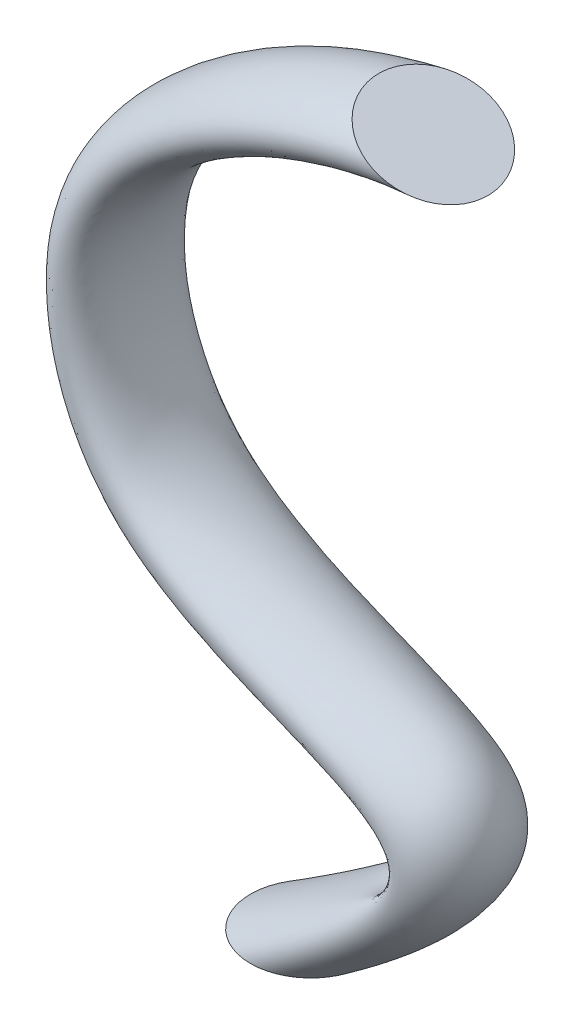
ISO-10303-21;
HEADER;
FILE_DESCRIPTION(('STEP AP214'),'2;1');
FILE_NAME('part.step','',(''),(''),'','','');
FILE_SCHEMA(('AUTOMOTIVE_DESIGN { 1 0 10303 214 1 1 1 1 }'));
ENDSEC;
DATA;
#1=APPLICATION_CONTEXT('core data for automotive mechanical design processes');
#2=APPLICATION_PROTOCOL_DEFINITION('international standard','automotive_design',2000,#1);
#3=PRODUCT_CONTEXT('',#1,'mechanical');
#4=PRODUCT('Part','Part','',(#3));
#5=PRODUCT_RELATED_PRODUCT_CATEGORY('part','',(#4));
#6=PRODUCT_DEFINITION_FORMATION('','',#4);
#7=PRODUCT_DEFINITION_CONTEXT('part definition',#1,'design');
#8=PRODUCT_DEFINITION('design','',#6,#7);
#9=PRODUCT_DEFINITION_SHAPE('','',#8);
#10=(LENGTH_UNIT() NAMED_UNIT(*) SI_UNIT(.MILLI.,.METRE.));
#11=(NAMED_UNIT(*) PLANE_ANGLE_UNIT() SI_UNIT($,.RADIAN.));
#12=(NAMED_UNIT(*) SI_UNIT($,.STERADIAN.) SOLID_ANGLE_UNIT());
#13=UNCERTAINTY_MEASURE_WITH_UNIT(LENGTH_MEASURE(1.E-05),#10,'distance_accuracy_value','');
#14=(GEOMETRIC_REPRESENTATION_CONTEXT(3) GLOBAL_UNCERTAINTY_ASSIGNED_CONTEXT((#13)) GLOBAL_UNIT_ASSIGNED_CONTEXT((#10,
#11,#12)) REPRESENTATION_CONTEXT('',''));
#15=CARTESIAN_POINT('',(0.,0.,0.));
#16=DIRECTION('',(0.,0.,1.));
#17=DIRECTION('',(1.,0.,0.));
#18=AXIS2_PLACEMENT_3D('',#15,#16,#17);
#19=CARTESIAN_POINT('',(0.,0.,0.));
#20=DIRECTION('',(0.,1.,0.));
#21=DIRECTION('',(0.,0.,1.));
#22=AXIS2_PLACEMENT_3D('',#19,#20,#21);
#23=PLANE('',#22);
#24=CARTESIAN_POINT('',(0.,0.,0.));
#25=DIRECTION('',(0.,1.,0.));
#26=DIRECTION('',(0.,0.,1.));
#27=AXIS2_PLACEMENT_3D('',#24,#25,#26);
#28=CIRCLE('',#27,6.);
#29=CARTESIAN_POINT('',(0.,0.,6.));
#30=VERTEX_POINT('',#29);
#31=EDGE_CURVE('E42',#30,#30,#28,.T.);
#32=ORIENTED_EDGE('',*,*,#31,.F.);
#33=EDGE_LOOP('',(#32));
#34=FACE_BOUND('',#33,.T.);
#35=ADVANCED_FACE('F35',(#34),#23,.F.);
#36=CARTESIAN_POINT('',(12.1887811854441,74.5590338471317,0.));
#37=DIRECTION('',(0.425588156820122,0.904916968994643,0.));
#38=DIRECTION('',(0.,0.,1.));
#39=AXIS2_PLACEMENT_3D('',#36,#37,#38);
#40=PLANE('',#39);
#41=CARTESIAN_POINT('',(12.1887811854441,74.5590338471317,0.));
#42=DIRECTION('',(0.425588156820122,0.904916968994643,0.));
#43=DIRECTION('',(0.,0.,1.));
#44=AXIS2_PLACEMENT_3D('',#41,#42,#43);
#45=CIRCLE('',#44,6.);
#46=CARTESIAN_POINT('',(12.1887811854441,74.5590338471317,6.));
#47=VERTEX_POINT('',#46);
#48=EDGE_CURVE('E11',#47,#47,#45,.T.);
#49=ORIENTED_EDGE('',*,*,#48,.T.);
#50=EDGE_LOOP('',(#49));
#51=FACE_BOUND('',#50,.T.);
#52=ADVANCED_FACE('F49',(#51),#40,.T.);
#53=CARTESIAN_POINT('',(0.,0.,6.));
#54=CARTESIAN_POINT('',(4.11271441818449,2.73489540008512,6.));
#55=CARTESIAN_POINT('',(7.19958615840725,5.08062696988915,6.));
#56=CARTESIAN_POINT('',(10.5410023883962,8.13591783761968,6.));
#57=CARTESIAN_POINT('',(11.4399925668278,9.077130378308,6.));
#58=CARTESIAN_POINT('',(12.8499879055733,10.8251931750027,6.));
#59=CARTESIAN_POINT('',(13.3609930619636,11.63204342912,6.));
#60=CARTESIAN_POINT('',(13.8677461144264,12.7566020049984,6.));
#61=CARTESIAN_POINT('',(13.9933713489463,13.1171687281515,6.));
#62=CARTESIAN_POINT('',(14.1632426065619,13.8122390585336,6.));
#63=CARTESIAN_POINT('',(14.207488625153,14.1467426635971,6.));
#64=CARTESIAN_POINT('',(14.2198071318815,14.7921959095221,6.));
#65=CARTESIAN_POINT('',(14.1878796145475,15.1031455477483,6.));
#66=CARTESIAN_POINT('',(14.0530567300514,15.7040000115565,6.));
#67=CARTESIAN_POINT('',(13.9501613569036,15.9939048342515,6.));
#68=CARTESIAN_POINT('',(13.5428319827084,16.8358158102474,6.));
#69=CARTESIAN_POINT('',(13.139754709432,17.3600184630216,6.));
#70=CARTESIAN_POINT('',(12.1121969088459,18.3543543259313,6.));
#71=CARTESIAN_POINT('',(11.4877163724356,18.8244875316663,6.));
#72=CARTESIAN_POINT('',(10.0589974822064,19.7307577088766,6.));
#73=CARTESIAN_POINT('',(9.25475912175399,20.1668946771491,6.));
#74=CARTESIAN_POINT('',(7.50817002082103,21.0252455881865,6.));
#75=CARTESIAN_POINT('',(6.56581927534458,21.4474595285374,6.));
#76=CARTESIAN_POINT('',(3.59406662613446,22.7233266250199,6.));
#77=CARTESIAN_POINT('',(1.41996429733047,23.5862050506563,6.));
#78=CARTESIAN_POINT('',(-2.98094462348842,25.497148308928,6.));
#79=CARTESIAN_POINT('',(-5.20775122216097,26.5452131383385,6.));
#80=CARTESIAN_POINT('',(-9.38090516887459,28.9871148812916,6.));
#81=CARTESIAN_POINT('',(-11.3272525228269,30.3809517923993,6.));
#82=CARTESIAN_POINT('',(-14.3366030747234,33.4040314699253,6.));
#83=CARTESIAN_POINT('',(-15.4922503698786,34.9568248956479,6.));
#84=CARTESIAN_POINT('',(-17.3610741904315,38.2830919803696,6.));
#85=CARTESIAN_POINT('',(-18.0742507166652,40.0565656428151,6.));
#86=CARTESIAN_POINT('',(-19.0439968027881,43.6914143598938,6.));
#87=CARTESIAN_POINT('',(-19.3005663630961,45.5527894187039,6.));
#88=CARTESIAN_POINT('',(-19.342962319861,49.2306620884934,6.));
#89=CARTESIAN_POINT('',(-19.1287887164884,51.0471597034938,6.));
#90=CARTESIAN_POINT('',(-18.2696326731837,54.2979141630244,6.));
#91=CARTESIAN_POINT('',(-17.6786683246516,55.7519628474315,6.));
#92=CARTESIAN_POINT('',(-16.1784004167708,58.5160701671312,6.));
#93=CARTESIAN_POINT('',(-15.2690968551027,59.8261288029575,6.));
#94=CARTESIAN_POINT('',(-12.1514332988085,63.5314434776207,6.));
#95=CARTESIAN_POINT('',(-9.55332042551793,65.7018382843323,6.));
#96=CARTESIAN_POINT('',(-3.78578538649166,69.3956584234606,6.));
#97=CARTESIAN_POINT('',(-0.616363216244874,70.9190837563743,6.));
#98=CARTESIAN_POINT('',(5.8257587137848,73.2716254274942,6.));
#99=CARTESIAN_POINT('',(9.098458475498,74.100741765863,6.));
#100=CARTESIAN_POINT('',(12.1887811854441,74.5590338471317,6.));
#101=CARTESIAN_POINT('',(12.,0.,6.));
#102=CARTESIAN_POINT('',(16.1127144183344,3.13009065498339,6.));
#103=CARTESIAN_POINT('',(19.2007570455439,5.99806282840083,6.));
#104=CARTESIAN_POINT('',(22.3277806819016,10.4357667980795,6.));
#105=CARTESIAN_POINT('',(23.1183732507906,11.9435611779781,6.));
#106=CARTESIAN_POINT('',(24.062467763017,15.1704545258535,6.));
#107=CARTESIAN_POINT('',(24.2195304485428,16.9047946247703,6.));
#108=CARTESIAN_POINT('',(23.6834655680169,19.6905104364739,6.));
#109=CARTESIAN_POINT('',(23.3723056073015,20.6470614103541,6.));
#110=CARTESIAN_POINT('',(22.4384102348518,22.5406576839655,6.));
#111=CARTESIAN_POINT('',(21.812905506898,23.4761517854179,6.));
#112=CARTESIAN_POINT('',(20.2828457203267,25.1902631863547,6.));
#113=CARTESIAN_POINT('',(19.3795665711912,25.96440444433,6.));
#114=CARTESIAN_POINT('',(17.4530002778942,27.252200842384,6.));
#115=CARTESIAN_POINT('',(16.4348874808336,27.7655275001085,6.));
#116=CARTESIAN_POINT('',(13.4622055037567,28.9590727264586,6.));
#117=CARTESIAN_POINT('',(11.6336568941156,29.3139071614577,6.));
#118=CARTESIAN_POINT('',(8.49819136784968,29.8479503885667,6.));
#119=CARTESIAN_POINT('',(7.14900351090796,30.0282761417737,6.));
#120=CARTESIAN_POINT('',(4.64033680117676,30.4539766819075,6.));
#121=CARTESIAN_POINT('',(3.47839559334489,30.689474872775,6.));
#122=CARTESIAN_POINT('',(1.21019645993242,31.2441789307287,6.));
#123=CARTESIAN_POINT('',(0.106033111115423,31.5610949173249,6.));
#124=CARTESIAN_POINT('',(-3.1677636781012,32.6397515467083,6.));
#125=CARTESIAN_POINT('',(-5.30749085737645,33.5261731317714,6.));
#126=CARTESIAN_POINT('',(-9.29158708889669,35.7068206823805,6.));
#127=CARTESIAN_POINT('',(-11.1304746298859,37.0071218707789,6.));
#128=CARTESIAN_POINT('',(-13.9952115952691,40.088392422565,6.));
#129=CARTESIAN_POINT('',(-15.0047579264562,41.8846348072484,6.));
#130=CARTESIAN_POINT('',(-15.5597155767183,45.3957575707424,6.));
#131=CARTESIAN_POINT('',(-15.626283470194,47.0006749052141,6.));
#132=CARTESIAN_POINT('',(-15.4298950259224,50.1718612596309,6.));
#133=CARTESIAN_POINT('',(-15.1641953847882,51.7400791167712,6.));
#134=CARTESIAN_POINT('',(-14.2651950321024,54.7429284086035,6.));
#135=CARTESIAN_POINT('',(-13.6294739592361,56.1775057230932,6.));
#136=CARTESIAN_POINT('',(-11.955756385577,58.7425007156713,6.));
#137=CARTESIAN_POINT('',(-10.9150610870986,59.8709514367097,6.));
#138=CARTESIAN_POINT('',(-8.61892047379111,61.5016101948676,6.));
#139=CARTESIAN_POINT('',(-7.48658374928332,62.147831625923,6.));
#140=CARTESIAN_POINT('',(-5.15716941153451,63.344961612256,6.));
#141=CARTESIAN_POINT('',(-3.95679370343208,63.8964384799113,6.));
#142=CARTESIAN_POINT('',(-0.222926881596724,65.4944077117654,6.));
#143=CARTESIAN_POINT('',(2.46204367232007,66.4915105396877,6.));
#144=CARTESIAN_POINT('',(8.19529839471924,68.1930828039999,6.));
#145=CARTESIAN_POINT('',(11.2371210419315,68.8848151521953,6.));
#146=CARTESIAN_POINT('',(17.3030675805863,69.6779199592841,6.));
#147=CARTESIAN_POINT('',(20.3280625043299,69.7816818268664,6.));
#148=CARTESIAN_POINT('',(23.0477848133799,69.4519759652903,6.));
#149=CARTESIAN_POINT('',(12.,0.,-6.));
#150=CARTESIAN_POINT('',(16.1127144183344,3.13009065498339,-6.));
#151=CARTESIAN_POINT('',(19.2007570455439,5.99806282840083,-6.));
#152=CARTESIAN_POINT('',(22.3277806819016,10.4357667980795,-6.));
#153=CARTESIAN_POINT('',(23.1183732507906,11.9435611779781,-6.));
#154=CARTESIAN_POINT('',(24.062467763017,15.1704545258535,-6.));
#155=CARTESIAN_POINT('',(24.2195304485428,16.9047946247703,-6.));
#156=CARTESIAN_POINT('',(23.6834655680169,19.6905104364739,-6.));
#157=CARTESIAN_POINT('',(23.3723056073015,20.6470614103541,-6.));
#158=CARTESIAN_POINT('',(22.4384102348518,22.5406576839655,-6.));
#159=CARTESIAN_POINT('',(21.812905506898,23.4761517854179,-6.));
#160=CARTESIAN_POINT('',(20.2828457203267,25.1902631863547,-6.));
#161=CARTESIAN_POINT('',(19.3795665711912,25.96440444433,-6.));
#162=CARTESIAN_POINT('',(17.4530002778942,27.252200842384,-6.));
#163=CARTESIAN_POINT('',(16.4348874808336,27.7655275001085,-6.));
#164=CARTESIAN_POINT('',(13.4622055037567,28.9590727264586,-6.));
#165=CARTESIAN_POINT('',(11.6336568941156,29.3139071614577,-6.));
#166=CARTESIAN_POINT('',(8.49819136784968,29.8479503885667,-6.));
#167=CARTESIAN_POINT('',(7.14900351090796,30.0282761417737,-6.));
#168=CARTESIAN_POINT('',(4.64033680117676,30.4539766819075,-6.));
#169=CARTESIAN_POINT('',(3.47839559334489,30.689474872775,-6.));
#170=CARTESIAN_POINT('',(1.21019645993242,31.2441789307287,-6.));
#171=CARTESIAN_POINT('',(0.106033111115423,31.5610949173249,-6.));
#172=CARTESIAN_POINT('',(-3.1677636781012,32.6397515467083,-6.));
#173=CARTESIAN_POINT('',(-5.30749085737645,33.5261731317714,-6.));
#174=CARTESIAN_POINT('',(-9.29158708889669,35.7068206823805,-6.));
#175=CARTESIAN_POINT('',(-11.1304746298859,37.0071218707789,-6.));
#176=CARTESIAN_POINT('',(-13.9952115952691,40.088392422565,-6.));
#177=CARTESIAN_POINT('',(-15.0047579264562,41.8846348072484,-6.));
#178=CARTESIAN_POINT('',(-15.5597155767183,45.3957575707424,-6.));
#179=CARTESIAN_POINT('',(-15.626283470194,47.0006749052141,-6.));
#180=CARTESIAN_POINT('',(-15.4298950259224,50.1718612596309,-6.));
#181=CARTESIAN_POINT('',(-15.1641953847882,51.7400791167712,-6.));
#182=CARTESIAN_POINT('',(-14.2651950321024,54.7429284086035,-6.));
#183=CARTESIAN_POINT('',(-13.6294739592361,56.1775057230932,-6.));
#184=CARTESIAN_POINT('',(-11.955756385577,58.7425007156713,-6.));
#185=CARTESIAN_POINT('',(-10.9150610870986,59.8709514367097,-6.));
#186=CARTESIAN_POINT('',(-8.61892047379111,61.5016101948676,-6.));
#187=CARTESIAN_POINT('',(-7.48658374928332,62.147831625923,-6.));
#188=CARTESIAN_POINT('',(-5.15716941153451,63.344961612256,-6.));
#189=CARTESIAN_POINT('',(-3.95679370343208,63.8964384799113,-6.));
#190=CARTESIAN_POINT('',(-0.222926881596724,65.4944077117654,-6.));
#191=CARTESIAN_POINT('',(2.46204367232007,66.4915105396877,-6.));
#192=CARTESIAN_POINT('',(8.19529839471924,68.1930828039999,-6.));
#193=CARTESIAN_POINT('',(11.2371210419315,68.8848151521953,-6.));
#194=CARTESIAN_POINT('',(17.3030675805863,69.6779199592841,-6.));
#195=CARTESIAN_POINT('',(20.3280625043299,69.7816818268664,-6.));
#196=CARTESIAN_POINT('',(23.0477848133799,69.4519759652903,-6.));
#197=CARTESIAN_POINT('',(0.,0.,-6.));
#198=CARTESIAN_POINT('',(4.11271441818449,2.73489540008512,-6.));
#199=CARTESIAN_POINT('',(7.19958615840725,5.08062696988915,-6.));
#200=CARTESIAN_POINT('',(10.5410023883962,8.13591783761968,-6.));
#201=CARTESIAN_POINT('',(11.4399925668278,9.077130378308,-6.));
#202=CARTESIAN_POINT('',(12.8499879055733,10.8251931750027,-6.));
#203=CARTESIAN_POINT('',(13.3609930619636,11.63204342912,-6.));
#204=CARTESIAN_POINT('',(13.8677461144264,12.7566020049984,-6.));
#205=CARTESIAN_POINT('',(13.9933713489463,13.1171687281515,-6.));
#206=CARTESIAN_POINT('',(14.1632426065619,13.8122390585336,-6.));
#207=CARTESIAN_POINT('',(14.207488625153,14.1467426635971,-6.));
#208=CARTESIAN_POINT('',(14.2198071318815,14.7921959095221,-6.));
#209=CARTESIAN_POINT('',(14.1878796145475,15.1031455477483,-6.));
#210=CARTESIAN_POINT('',(14.0530567300514,15.7040000115565,-6.));
#211=CARTESIAN_POINT('',(13.9501613569036,15.9939048342515,-6.));
#212=CARTESIAN_POINT('',(13.5428319827084,16.8358158102474,-6.));
#213=CARTESIAN_POINT('',(13.139754709432,17.3600184630216,-6.));
#214=CARTESIAN_POINT('',(12.1121969088459,18.3543543259313,-6.));
#215=CARTESIAN_POINT('',(11.4877163724356,18.8244875316663,-6.));
#216=CARTESIAN_POINT('',(10.0589974822064,19.7307577088766,-6.));
#217=CARTESIAN_POINT('',(9.25475912175399,20.1668946771491,-6.));
#218=CARTESIAN_POINT('',(7.50817002082103,21.0252455881865,-6.));
#219=CARTESIAN_POINT('',(6.56581927534458,21.4474595285374,-6.));
#220=CARTESIAN_POINT('',(3.59406662613446,22.7233266250199,-6.));
#221=CARTESIAN_POINT('',(1.41996429733047,23.5862050506563,-6.));
#222=CARTESIAN_POINT('',(-2.98094462348842,25.497148308928,-6.));
#223=CARTESIAN_POINT('',(-5.20775122216097,26.5452131383385,-6.));
#224=CARTESIAN_POINT('',(-9.38090516887459,28.9871148812916,-6.));
#225=CARTESIAN_POINT('',(-11.3272525228269,30.3809517923993,-6.));
#226=CARTESIAN_POINT('',(-14.3366030747234,33.4040314699253,-6.));
#227=CARTESIAN_POINT('',(-15.4922503698786,34.9568248956479,-6.));
#228=CARTESIAN_POINT('',(-17.3610741904315,38.2830919803696,-6.));
#229=CARTESIAN_POINT('',(-18.0742507166652,40.0565656428151,-6.));
#230=CARTESIAN_POINT('',(-19.0439968027881,43.6914143598938,-6.));
#231=CARTESIAN_POINT('',(-19.3005663630961,45.5527894187039,-6.));
#232=CARTESIAN_POINT('',(-19.342962319861,49.2306620884934,-6.));
#233=CARTESIAN_POINT('',(-19.1287887164884,51.0471597034938,-6.));
#234=CARTESIAN_POINT('',(-18.2696326731837,54.2979141630244,-6.));
#235=CARTESIAN_POINT('',(-17.6786683246516,55.7519628474315,-6.));
#236=CARTESIAN_POINT('',(-16.1784004167708,58.5160701671312,-6.));
#237=CARTESIAN_POINT('',(-15.2690968551027,59.8261288029575,-6.));
#238=CARTESIAN_POINT('',(-12.1514332988085,63.5314434776207,-6.));
#239=CARTESIAN_POINT('',(-9.55332042551793,65.7018382843323,-6.));
#240=CARTESIAN_POINT('',(-3.78578538649166,69.3956584234606,-6.));
#241=CARTESIAN_POINT('',(-0.616363216244873,70.9190837563743,-6.));
#242=CARTESIAN_POINT('',(5.8257587137848,73.2716254274942,-6.));
#243=CARTESIAN_POINT('',(9.098458475498,74.100741765863,-6.));
#244=CARTESIAN_POINT('',(12.1887811854441,74.5590338471317,-6.));
#245=CARTESIAN_POINT('',(-12.,0.,-6.));
#246=CARTESIAN_POINT('',(-7.88728558196546,2.33970014518686,-6.));
#247=CARTESIAN_POINT('',(-4.80158472872945,4.16319111137748,-6.));
#248=CARTESIAN_POINT('',(-1.24577590510915,5.83606887715982,-6.));
#249=CARTESIAN_POINT('',(-0.238388117134903,6.21069957863793,-6.));
#250=CARTESIAN_POINT('',(1.6375080481297,6.47993182415195,-6.));
#251=CARTESIAN_POINT('',(2.50245567538435,6.35929223346976,-6.));
#252=CARTESIAN_POINT('',(4.05202666083596,5.82269357352291,-6.));
#253=CARTESIAN_POINT('',(4.61443709059107,5.58727604594902,-6.));
#254=CARTESIAN_POINT('',(5.88807497827195,5.08382043310173,-6.));
#255=CARTESIAN_POINT('',(6.60207174340796,4.81733354177629,-6.));
#256=CARTESIAN_POINT('',(8.15676854343623,4.39412863268952,-6.));
#257=CARTESIAN_POINT('',(8.99619265790379,4.24188665116661,-6.));
#258=CARTESIAN_POINT('',(10.6531131822085,4.15579918072897,-6.));
#259=CARTESIAN_POINT('',(11.4654352329737,4.22228216839443,-6.));
#260=CARTESIAN_POINT('',(13.6234584616602,4.71255889403612,-6.));
#261=CARTESIAN_POINT('',(14.6458525247483,5.40612976458563,-6.));
#262=CARTESIAN_POINT('',(15.7262024498421,6.86075826329589,-6.));
#263=CARTESIAN_POINT('',(15.8264292339633,7.62069892155891,-6.));
#264=CARTESIAN_POINT('',(15.4776581632359,9.00753873584576,-6.));
#265=CARTESIAN_POINT('',(15.0311226501631,9.6443144815232,-6.));
#266=CARTESIAN_POINT('',(13.8061435817096,10.8063122456444,-6.));
#267=CARTESIAN_POINT('',(13.0256054395737,11.3338241397499,-6.));
#268=CARTESIAN_POINT('',(10.3558969303701,12.8069017033315,-6.));
#269=CARTESIAN_POINT('',(8.14741945203738,13.6462369695412,-6.));
#270=CARTESIAN_POINT('',(3.32969784191984,15.2874759354755,-6.));
#271=CARTESIAN_POINT('',(0.714972185563945,16.0833044058981,-6.));
#272=CARTESIAN_POINT('',(-4.76659874248008,17.8858373400182,-6.));
#273=CARTESIAN_POINT('',(-7.64974711919746,18.8772687775502,-6.));
#274=CARTESIAN_POINT('',(-13.1134905727286,21.4123053691082,-6.));
#275=CARTESIAN_POINT('',(-15.3582172695633,22.9129748860817,-6.));
#276=CARTESIAN_POINT('',(-19.2922533549406,26.3943227011084,-6.));
#277=CARTESIAN_POINT('',(-20.9843060485423,28.373052168859,-6.));
#278=CARTESIAN_POINT('',(-23.8227985734739,32.6399003111841,-6.));
#279=CARTESIAN_POINT('',(-24.9716587669561,34.9280731143146,-6.));
#280=CARTESIAN_POINT('',(-26.7301682541449,39.7188234613154,-6.));
#281=CARTESIAN_POINT('',(-27.3425163458782,42.2233679702778,-6.));
#282=CARTESIAN_POINT('',(-27.9203448725762,47.0942181311813,-6.));
#283=CARTESIAN_POINT('',(-27.87075290002,49.3560940689401,-6.));
#284=CARTESIAN_POINT('',(-27.1996314220071,53.6871787220063,-6.));
#285=CARTESIAN_POINT('',(-26.5814000067733,55.7558191260038,-6.));
#286=CARTESIAN_POINT('',(-24.0799397160203,61.568479243476,-6.));
#287=CARTESIAN_POINT('',(-21.5686845233559,64.9121660289768,-6.));
#288=CARTESIAN_POINT('',(-15.7668691677026,70.5982340429214,-6.));
#289=CARTESIAN_POINT('',(-12.4698474744213,72.9533523605533,-6.));
#290=CARTESIAN_POINT('',(-5.65155015301674,76.8653308957042,-6.));
#291=CARTESIAN_POINT('',(-2.13114555333394,78.4198017048596,-6.));
#292=CARTESIAN_POINT('',(1.32977755750843,79.6660917289732,-6.));
#293=CARTESIAN_POINT('',(-12.,0.,6.));
#294=CARTESIAN_POINT('',(-7.88728558196546,2.33970014518686,6.));
#295=CARTESIAN_POINT('',(-4.80158472872945,4.16319111137748,6.));
#296=CARTESIAN_POINT('',(-1.24577590510915,5.83606887715982,6.));
#297=CARTESIAN_POINT('',(-0.238388117134903,6.21069957863793,6.));
#298=CARTESIAN_POINT('',(1.6375080481297,6.47993182415195,6.));
#299=CARTESIAN_POINT('',(2.50245567538435,6.35929223346976,6.));
#300=CARTESIAN_POINT('',(4.05202666083596,5.82269357352291,6.));
#301=CARTESIAN_POINT('',(4.61443709059107,5.58727604594902,6.));
#302=CARTESIAN_POINT('',(5.88807497827195,5.08382043310173,6.));
#303=CARTESIAN_POINT('',(6.60207174340796,4.81733354177629,6.));
#304=CARTESIAN_POINT('',(8.15676854343623,4.39412863268952,6.));
#305=CARTESIAN_POINT('',(8.99619265790379,4.24188665116661,6.));
#306=CARTESIAN_POINT('',(10.6531131822085,4.15579918072897,6.));
#307=CARTESIAN_POINT('',(11.4654352329737,4.22228216839443,6.));
#308=CARTESIAN_POINT('',(13.6234584616602,4.71255889403612,6.));
#309=CARTESIAN_POINT('',(14.6458525247483,5.40612976458563,6.));
#310=CARTESIAN_POINT('',(15.7262024498421,6.86075826329589,6.));
#311=CARTESIAN_POINT('',(15.8264292339633,7.62069892155891,6.));
#312=CARTESIAN_POINT('',(15.4776581632359,9.00753873584576,6.));
#313=CARTESIAN_POINT('',(15.0311226501631,9.6443144815232,6.));
#314=CARTESIAN_POINT('',(13.8061435817096,10.8063122456444,6.));
#315=CARTESIAN_POINT('',(13.0256054395737,11.3338241397499,6.));
#316=CARTESIAN_POINT('',(10.3558969303701,12.8069017033315,6.));
#317=CARTESIAN_POINT('',(8.14741945203738,13.6462369695412,6.));
#318=CARTESIAN_POINT('',(3.32969784191984,15.2874759354755,6.));
#319=CARTESIAN_POINT('',(0.714972185563945,16.0833044058981,6.));
#320=CARTESIAN_POINT('',(-4.76659874248008,17.8858373400182,6.));
#321=CARTESIAN_POINT('',(-7.64974711919746,18.8772687775502,6.));
#322=CARTESIAN_POINT('',(-13.1134905727286,21.4123053691082,6.));
#323=CARTESIAN_POINT('',(-15.3582172695633,22.9129748860817,6.));
#324=CARTESIAN_POINT('',(-19.2922533549406,26.3943227011084,6.));
#325=CARTESIAN_POINT('',(-20.9843060485423,28.373052168859,6.));
#326=CARTESIAN_POINT('',(-23.8227985734739,32.6399003111841,6.));
#327=CARTESIAN_POINT('',(-24.9716587669561,34.9280731143146,6.));
#328=CARTESIAN_POINT('',(-26.7301682541449,39.7188234613154,6.));
#329=CARTESIAN_POINT('',(-27.3425163458782,42.2233679702778,6.));
#330=CARTESIAN_POINT('',(-27.9203448725762,47.0942181311813,6.));
#331=CARTESIAN_POINT('',(-27.87075290002,49.3560940689401,6.));
#332=CARTESIAN_POINT('',(-27.1996314220071,53.6871787220063,6.));
#333=CARTESIAN_POINT('',(-26.5814000067733,55.7558191260038,6.));
#334=CARTESIAN_POINT('',(-24.0799397160203,61.568479243476,6.));
#335=CARTESIAN_POINT('',(-21.5686845233559,64.9121660289768,6.));
#336=CARTESIAN_POINT('',(-15.7668691677026,70.5982340429214,6.));
#337=CARTESIAN_POINT('',(-12.4698474744213,72.9533523605533,6.));
#338=CARTESIAN_POINT('',(-5.65155015301674,76.8653308957042,6.));
#339=CARTESIAN_POINT('',(-2.13114555333394,78.4198017048596,6.));
#340=CARTESIAN_POINT('',(1.32977755750843,79.6660917289732,6.));
#341=CARTESIAN_POINT('',(0.,0.,6.));
#342=CARTESIAN_POINT('',(4.11271441818449,2.73489540008512,6.));
#343=CARTESIAN_POINT('',(7.19958615840725,5.08062696988915,6.));
#344=CARTESIAN_POINT('',(10.5410023883962,8.13591783761968,6.));
#345=CARTESIAN_POINT('',(11.4399925668278,9.077130378308,6.));
#346=CARTESIAN_POINT('',(12.8499879055733,10.8251931750027,6.));
#347=CARTESIAN_POINT('',(13.3609930619636,11.63204342912,6.));
#348=CARTESIAN_POINT('',(13.8677461144264,12.7566020049984,6.));
#349=CARTESIAN_POINT('',(13.9933713489463,13.1171687281515,6.));
#350=CARTESIAN_POINT('',(14.1632426065619,13.8122390585336,6.));
#351=CARTESIAN_POINT('',(14.207488625153,14.1467426635971,6.));
#352=CARTESIAN_POINT('',(14.2198071318815,14.7921959095221,6.));
#353=CARTESIAN_POINT('',(14.1878796145475,15.1031455477483,6.));
#354=CARTESIAN_POINT('',(14.0530567300514,15.7040000115565,6.));
#355=CARTESIAN_POINT('',(13.9501613569036,15.9939048342515,6.));
#356=CARTESIAN_POINT('',(13.5428319827084,16.8358158102474,6.));
#357=CARTESIAN_POINT('',(13.139754709432,17.3600184630216,6.));
#358=CARTESIAN_POINT('',(12.1121969088459,18.3543543259313,6.));
#359=CARTESIAN_POINT('',(11.4877163724356,18.8244875316663,6.));
#360=CARTESIAN_POINT('',(10.0589974822064,19.7307577088766,6.));
#361=CARTESIAN_POINT('',(9.25475912175399,20.1668946771491,6.));
#362=CARTESIAN_POINT('',(7.50817002082103,21.0252455881865,6.));
#363=CARTESIAN_POINT('',(6.56581927534458,21.4474595285374,6.));
#364=CARTESIAN_POINT('',(3.59406662613446,22.7233266250199,6.));
#365=CARTESIAN_POINT('',(1.41996429733047,23.5862050506563,6.));
#366=CARTESIAN_POINT('',(-2.98094462348842,25.497148308928,6.));
#367=CARTESIAN_POINT('',(-5.20775122216097,26.5452131383385,6.));
#368=CARTESIAN_POINT('',(-9.38090516887459,28.9871148812916,6.));
#369=CARTESIAN_POINT('',(-11.3272525228269,30.3809517923993,6.));
#370=CARTESIAN_POINT('',(-14.3366030747234,33.4040314699253,6.));
#371=CARTESIAN_POINT('',(-15.4922503698786,34.9568248956479,6.));
#372=CARTESIAN_POINT('',(-17.3610741904315,38.2830919803696,6.));
#373=CARTESIAN_POINT('',(-18.0742507166652,40.0565656428151,6.));
#374=CARTESIAN_POINT('',(-19.0439968027881,43.6914143598938,6.));
#375=CARTESIAN_POINT('',(-19.3005663630961,45.5527894187039,6.));
#376=CARTESIAN_POINT('',(-19.342962319861,49.2306620884934,6.));
#377=CARTESIAN_POINT('',(-19.1287887164884,51.0471597034938,6.));
#378=CARTESIAN_POINT('',(-18.2696326731837,54.2979141630244,6.));
#379=CARTESIAN_POINT('',(-17.6786683246516,55.7519628474315,6.));
#380=CARTESIAN_POINT('',(-16.1784004167708,58.5160701671312,6.));
#381=CARTESIAN_POINT('',(-15.2690968551027,59.8261288029575,6.));
#382=CARTESIAN_POINT('',(-12.1514332988085,63.5314434776207,6.));
#383=CARTESIAN_POINT('',(-9.55332042551793,65.7018382843323,6.));
#384=CARTESIAN_POINT('',(-3.78578538649166,69.3956584234606,6.));
#385=CARTESIAN_POINT('',(-0.616363216244874,70.9190837563743,6.));
#386=CARTESIAN_POINT('',(5.8257587137848,73.2716254274942,6.));
#387=CARTESIAN_POINT('',(9.098458475498,74.100741765863,6.));
#388=CARTESIAN_POINT('',(12.1887811854441,74.5590338471317,6.));
#389=(BOUNDED_SURFACE() B_SPLINE_SURFACE(3,3,((#53,#54,#55,#56,#57,#58,#59,#60,#61,#62,#63,#64,
#65,#66,#67,#68,#69,#70,#71,#72,#73,#74,#75,#76,#77,#78,#79,#80,#81,#82,#83,#84,#85,#86,#87,#88,
#89,#90,#91,#92,#93,#94,#95,#96,#97,#98,#99,#100),(#101,#102,#103,#104,#105,#106,#107,#108,#109,
#110,#111,#112,#113,#114,#115,#116,#117,#118,#119,#120,#121,#122,#123,#124,#125,#126,#127,#128,
#129,#130,#131,#132,#133,#134,#135,#136,#137,#138,#139,#140,#141,#142,#143,#144,#145,#146,#147,
#148),(#149,#150,#151,#152,#153,#154,#155,#156,#157,#158,#159,#160,#161,#162,#163,#164,#165,
#166,#167,#168,#169,#170,#171,#172,#173,#174,#175,#176,#177,#178,#179,#180,#181,#182,#183,#184,
#185,#186,#187,#188,#189,#190,#191,#192,#193,#194,#195,#196),(#197,#198,#199,#200,#201,#202,
#203,#204,#205,#206,#207,#208,#209,#210,#211,#212,#213,#214,#215,#216,#217,#218,#219,#220,#221,
#222,#223,#224,#225,#226,#227,#228,#229,#230,#231,#232,#233,#234,#235,#236,#237,#238,#239,#240,
#241,#242,#243,#244),(#245,#246,#247,#248,#249,#250,#251,#252,#253,#254,#255,#256,#257,#258,
#259,#260,#261,#262,#263,#264,#265,#266,#267,#268,#269,#270,#271,#272,#273,#274,#275,#276,#277,
#278,#279,#280,#281,#282,#283,#284,#285,#286,#287,#288,#289,#290,#291,#292),(#293,#294,#295,
#296,#297,#298,#299,#300,#301,#302,#303,#304,#305,#306,#307,#308,#309,#310,#311,#312,#313,#314,
#315,#316,#317,#318,#319,#320,#321,#322,#323,#324,#325,#326,#327,#328,#329,#330,#331,#332,#333,
#334,#335,#336,#337,#338,#339,#340),(#341,#342,#343,#344,#345,#346,#347,#348,#349,#350,#351,
#352,#353,#354,#355,#356,#357,#358,#359,#360,#361,#362,#363,#364,#365,#366,#367,#368,#369,#370,
#371,#372,#373,#374,#375,#376,#377,#378,#379,#380,#381,#382,#383,#384,#385,#386,#387,#388)),
.UNSPECIFIED.,.T.,.F.,.F.) B_SPLINE_SURFACE_WITH_KNOTS((4,3,4),(4,2,2,2,2,2,2,2,2,2,2,2,2,2,2,2,
2,2,2,2,2,2,2,4),(0.,0.5,1.),(0.,0.0580235385366428,0.0870353078049643,0.116047077073286,
0.130552961707446,0.145058846341607,0.159564730975768,0.174070615609929,0.20308238487825,
0.232094154146571,0.261105923414893,0.290117692683214,0.348141231219857,0.4061647697565,
0.464188308293143,0.512666347437933,0.561144386582724,0.609622425727514,0.658100464872305,
0.700837906763267,0.743575348654229,0.829050232436153,0.914525116218076,1.),
.UNSPECIFIED.) GEOMETRIC_REPRESENTATION_ITEM() RATIONAL_B_SPLINE_SURFACE(((1.,1.,1.,1.,1.,1.,1.,
1.,1.,1.,1.,1.,1.,1.,1.,1.,1.,1.,1.,1.,1.,1.,1.,1.,1.,1.,1.,1.,1.,1.,1.,1.,1.,1.,1.,1.,1.,1.,1.,
1.,1.,1.,1.,1.,1.,1.,1.,1.),(0.333333333333333,0.333333333333333,0.333333333333333,
0.333333333333333,0.333333333333333,0.333333333333333,0.333333333333333,0.333333333333333,
0.333333333333333,0.333333333333333,0.333333333333333,0.333333333333333,0.333333333333333,
0.333333333333333,0.333333333333333,0.333333333333333,0.333333333333333,0.333333333333333,
0.333333333333333,0.333333333333333,0.333333333333333,0.333333333333333,0.333333333333333,
0.333333333333333,0.333333333333333,0.333333333333333,0.333333333333333,0.333333333333333,
0.333333333333333,0.333333333333333,0.333333333333333,0.333333333333333,0.333333333333333,
0.333333333333333,0.333333333333333,0.333333333333333,0.333333333333333,0.333333333333333,
0.333333333333333,0.333333333333333,0.333333333333333,0.333333333333333,0.333333333333333,
0.333333333333333,0.333333333333333,0.333333333333333,0.333333333333333,0.333333333333333),
(0.333333333333333,0.333333333333333,0.333333333333333,0.333333333333333,0.333333333333333,
0.333333333333333,0.333333333333333,0.333333333333333,0.333333333333333,0.333333333333333,
0.333333333333333,0.333333333333333,0.333333333333333,0.333333333333333,0.333333333333333,
0.333333333333333,0.333333333333333,0.333333333333333,0.333333333333333,0.333333333333333,
0.333333333333333,0.333333333333333,0.333333333333333,0.333333333333333,0.333333333333333,
0.333333333333333,0.333333333333333,0.333333333333333,0.333333333333333,0.333333333333333,
0.333333333333333,0.333333333333333,0.333333333333333,0.333333333333333,0.333333333333333,
0.333333333333333,0.333333333333333,0.333333333333333,0.333333333333333,0.333333333333333,
0.333333333333333,0.333333333333333,0.333333333333333,0.333333333333333,0.333333333333333,
0.333333333333333,0.333333333333333,0.333333333333333),(1.,1.,1.,1.,1.,1.,1.,1.,1.,1.,1.,1.,1.,
1.,1.,1.,1.,1.,1.,1.,1.,1.,1.,1.,1.,1.,1.,1.,1.,1.,1.,1.,1.,1.,1.,1.,1.,1.,1.,1.,1.,1.,1.,1.,1.,
1.,1.,1.),(0.333333333333333,0.333333333333333,0.333333333333333,0.333333333333333,
0.333333333333333,0.333333333333333,0.333333333333333,0.333333333333333,0.333333333333333,
0.333333333333333,0.333333333333333,0.333333333333333,0.333333333333333,0.333333333333333,
0.333333333333333,0.333333333333333,0.333333333333333,0.333333333333333,0.333333333333333,
0.333333333333333,0.333333333333333,0.333333333333333,0.333333333333333,0.333333333333333,
0.333333333333333,0.333333333333333,0.333333333333333,0.333333333333333,0.333333333333333,
0.333333333333333,0.333333333333333,0.333333333333333,0.333333333333333,0.333333333333333,
0.333333333333333,0.333333333333333,0.333333333333333,0.333333333333333,0.333333333333333,
0.333333333333333,0.333333333333333,0.333333333333333,0.333333333333333,0.333333333333333,
0.333333333333333,0.333333333333333,0.333333333333333,0.333333333333333),(0.333333333333333,
0.333333333333333,0.333333333333333,0.333333333333333,0.333333333333333,0.333333333333333,
0.333333333333333,0.333333333333333,0.333333333333333,0.333333333333333,0.333333333333333,
0.333333333333333,0.333333333333333,0.333333333333333,0.333333333333333,0.333333333333333,
0.333333333333333,0.333333333333333,0.333333333333333,0.333333333333333,0.333333333333333,
0.333333333333333,0.333333333333333,0.333333333333333,0.333333333333333,0.333333333333333,
0.333333333333333,0.333333333333333,0.333333333333333,0.333333333333333,0.333333333333333,
0.333333333333333,0.333333333333333,0.333333333333333,0.333333333333333,0.333333333333333,
0.333333333333333,0.333333333333333,0.333333333333333,0.333333333333333,0.333333333333333,
0.333333333333333,0.333333333333333,0.333333333333333,0.333333333333333,0.333333333333333,
0.333333333333333,0.333333333333333),(1.,1.,1.,1.,1.,1.,1.,1.,1.,1.,1.,1.,1.,1.,1.,1.,1.,1.,1.,
1.,1.,1.,1.,1.,1.,1.,1.,1.,1.,1.,1.,1.,1.,1.,1.,1.,1.,1.,1.,1.,1.,1.,1.,1.,1.,1.,1.,1.))) REPRESENTATION_ITEM('') SURFACE());
#390=ORIENTED_EDGE('',*,*,#48,.F.);
#391=EDGE_LOOP('',(#390));
#392=FACE_BOUND('',#391,.T.);
#393=ORIENTED_EDGE('',*,*,#31,.T.);
#394=EDGE_LOOP('',(#393));
#395=FACE_BOUND('',#394,.T.);
#396=ADVANCED_FACE('F51',(#392,#395),#389,.T.);
#397=CLOSED_SHELL('',(#35,#52,#396));
#398=MANIFOLD_SOLID_BREP('B2',#397);
#399=ADVANCED_BREP_SHAPE_REPRESENTATION('',(#18,#398),#14);
#400=SHAPE_DEFINITION_REPRESENTATION(#9,#399);
ENDSEC;
END-ISO-10303-21;
